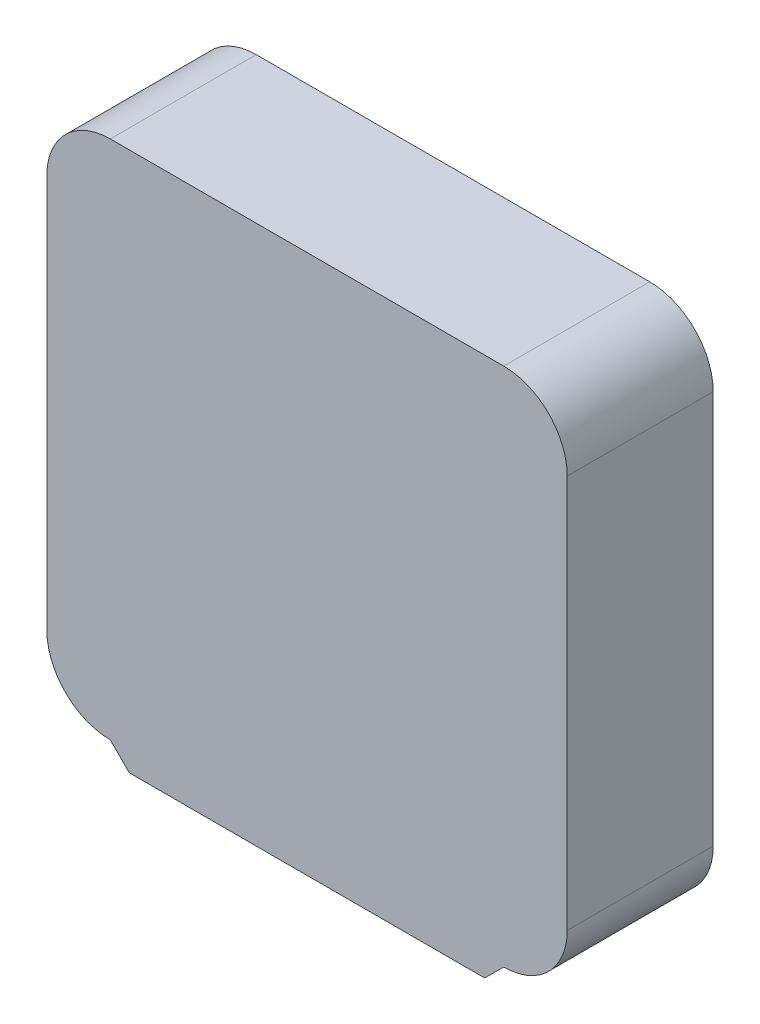
ISO-10303-21;
HEADER;
FILE_DESCRIPTION(('STEP AP214'),'2;1');
FILE_NAME('part.step','',(''),(''),'','','');
FILE_SCHEMA(('AUTOMOTIVE_DESIGN { 1 0 10303 214 1 1 1 1 }'));
ENDSEC;
DATA;
#1=APPLICATION_CONTEXT('core data for automotive mechanical design processes');
#2=APPLICATION_PROTOCOL_DEFINITION('international standard','automotive_design',2000,#1);
#3=PRODUCT_CONTEXT('',#1,'mechanical');
#4=PRODUCT('Part','Part','',(#3));
#5=PRODUCT_RELATED_PRODUCT_CATEGORY('part','',(#4));
#6=PRODUCT_DEFINITION_FORMATION('','',#4);
#7=PRODUCT_DEFINITION_CONTEXT('part definition',#1,'design');
#8=PRODUCT_DEFINITION('design','',#6,#7);
#9=PRODUCT_DEFINITION_SHAPE('','',#8);
#10=(LENGTH_UNIT() NAMED_UNIT(*) SI_UNIT(.MILLI.,.METRE.));
#11=(NAMED_UNIT(*) PLANE_ANGLE_UNIT() SI_UNIT($,.RADIAN.));
#12=(NAMED_UNIT(*) SI_UNIT($,.STERADIAN.) SOLID_ANGLE_UNIT());
#13=UNCERTAINTY_MEASURE_WITH_UNIT(LENGTH_MEASURE(1.E-05),#10,'distance_accuracy_value','');
#14=(GEOMETRIC_REPRESENTATION_CONTEXT(3) GLOBAL_UNCERTAINTY_ASSIGNED_CONTEXT((#13)) GLOBAL_UNIT_ASSIGNED_CONTEXT((#10,
#11,#12)) REPRESENTATION_CONTEXT('',''));
#15=CARTESIAN_POINT('',(0.,0.,0.));
#16=DIRECTION('',(0.,0.,1.));
#17=DIRECTION('',(1.,0.,0.));
#18=AXIS2_PLACEMENT_3D('',#15,#16,#17);
#19=CARTESIAN_POINT('',(3.80106510846566,0.848498758526367,0.));
#20=DIRECTION('',(0.,0.,1.));
#21=DIRECTION('',(1.,0.,0.));
#22=AXIS2_PLACEMENT_3D('',#19,#20,#21);
#23=PLANE('',#22);
#24=DIRECTION('',(-1.,0.,0.));
#25=VECTOR('',#24,1.);
#26=CARTESIAN_POINT('',(3.80106510846566,-21.1515012414736,0.));
#27=LINE('',#26,#25);
#28=CARTESIAN_POINT('',(17.8010651084656,-21.1515012414736,0.));
#29=VERTEX_POINT('',#28);
#30=CARTESIAN_POINT('',(-10.1989348915343,-21.1515012414736,0.));
#31=VERTEX_POINT('',#30);
#32=EDGE_CURVE('E176',#29,#31,#27,.T.);
#33=ORIENTED_EDGE('',*,*,#32,.T.);
#34=DIRECTION('',(0.707106781186547,-0.707106781186548,0.));
#35=VECTOR('',#34,1.);
#36=CARTESIAN_POINT('',(-10.9489348915343,-20.4015012414737,0.));
#37=LINE('',#36,#35);
#38=CARTESIAN_POINT('',(-11.6989348915343,-19.6515012414737,0.));
#39=VERTEX_POINT('',#38);
#40=EDGE_CURVE('E185',#39,#31,#37,.T.);
#41=ORIENTED_EDGE('',*,*,#40,.F.);
#42=CARTESIAN_POINT('',(-11.6989348915343,-14.6515012414736,0.));
#43=DIRECTION('',(0.,0.,1.));
#44=DIRECTION('',(1.,0.,0.));
#45=AXIS2_PLACEMENT_3D('',#42,#43,#44);
#46=CIRCLE('',#45,5.);
#47=CARTESIAN_POINT('',(-16.6989348915343,-14.6515012414736,0.));
#48=VERTEX_POINT('',#47);
#49=EDGE_CURVE('E164',#48,#39,#46,.T.);
#50=ORIENTED_EDGE('',*,*,#49,.F.);
#51=DIRECTION('',(0.,-1.,0.));
#52=VECTOR('',#51,1.);
#53=CARTESIAN_POINT('',(-16.6989348915343,-19.6515012414737,0.));
#54=LINE('',#53,#52);
#55=CARTESIAN_POINT('',(-16.6989348915343,16.3484987585264,0.));
#56=VERTEX_POINT('',#55);
#57=EDGE_CURVE('E194',#56,#48,#54,.T.);
#58=ORIENTED_EDGE('',*,*,#57,.F.);
#59=CARTESIAN_POINT('',(-11.6989348915343,16.3484987585264,0.));
#60=DIRECTION('',(0.,0.,1.));
#61=DIRECTION('',(1.,0.,0.));
#62=AXIS2_PLACEMENT_3D('',#59,#60,#61);
#63=CIRCLE('',#62,5.);
#64=CARTESIAN_POINT('',(-11.6989348915343,21.3484987585264,0.));
#65=VERTEX_POINT('',#64);
#66=EDGE_CURVE('E136',#65,#56,#63,.T.);
#67=ORIENTED_EDGE('',*,*,#66,.F.);
#68=DIRECTION('',(-1.,0.,0.));
#69=VECTOR('',#68,1.);
#70=CARTESIAN_POINT('',(-16.6989348915343,21.3484987585264,0.));
#71=LINE('',#70,#69);
#72=CARTESIAN_POINT('',(19.3010651084657,21.3484987585264,0.));
#73=VERTEX_POINT('',#72);
#74=EDGE_CURVE('E131',#73,#65,#71,.T.);
#75=ORIENTED_EDGE('',*,*,#74,.F.);
#76=CARTESIAN_POINT('',(19.3010651084657,16.3484987585264,0.));
#77=DIRECTION('',(0.,0.,1.));
#78=DIRECTION('',(1.,0.,0.));
#79=AXIS2_PLACEMENT_3D('',#76,#77,#78);
#80=CIRCLE('',#79,5.);
#81=CARTESIAN_POINT('',(24.3010651084657,16.3484987585264,0.));
#82=VERTEX_POINT('',#81);
#83=EDGE_CURVE('E203',#82,#73,#80,.T.);
#84=ORIENTED_EDGE('',*,*,#83,.F.);
#85=DIRECTION('',(0.,1.,0.));
#86=VECTOR('',#85,1.);
#87=CARTESIAN_POINT('',(24.3010651084657,21.3484987585264,0.));
#88=LINE('',#87,#86);
#89=CARTESIAN_POINT('',(24.3010651084657,-14.6515012414736,0.));
#90=VERTEX_POINT('',#89);
#91=EDGE_CURVE('E212',#90,#82,#88,.T.);
#92=ORIENTED_EDGE('',*,*,#91,.F.);
#93=CARTESIAN_POINT('',(19.3010651084657,-14.6515012414736,0.));
#94=DIRECTION('',(0.,0.,1.));
#95=DIRECTION('',(1.,0.,0.));
#96=AXIS2_PLACEMENT_3D('',#93,#94,#95);
#97=CIRCLE('',#96,5.);
#98=CARTESIAN_POINT('',(19.3010651084657,-19.6515012414737,0.));
#99=VERTEX_POINT('',#98);
#100=EDGE_CURVE('E48',#99,#90,#97,.T.);
#101=ORIENTED_EDGE('',*,*,#100,.F.);
#102=DIRECTION('',(0.707106781186546,0.707106781186549,0.));
#103=VECTOR('',#102,1.);
#104=CARTESIAN_POINT('',(18.5510651084656,-20.4015012414737,0.));
#105=LINE('',#104,#103);
#106=EDGE_CURVE('E11',#29,#99,#105,.T.);
#107=ORIENTED_EDGE('',*,*,#106,.F.);
#108=EDGE_LOOP('',(#33,#41,#50,#58,#67,#75,#84,#92,#101,#107));
#109=FACE_BOUND('',#108,.T.);
#110=ADVANCED_FACE('F18',(#109),#23,.F.);
#111=CARTESIAN_POINT('',(18.5510651084656,-20.4015012414737,8.625));
#112=DIRECTION('',(0.707106781186549,-0.707106781186546,0.));
#113=DIRECTION('',(0.,0.,-1.));
#114=AXIS2_PLACEMENT_3D('',#111,#112,#113);
#115=PLANE('',#114);
#116=DIRECTION('',(0.707106781186548,0.707106781186548,0.));
#117=VECTOR('',#116,1.);
#118=CARTESIAN_POINT('',(17.8010651084656,-21.1515012414736,11.5));
#119=LINE('',#118,#117);
#120=CARTESIAN_POINT('',(17.8010651084656,-21.1515012414736,11.5));
#121=VERTEX_POINT('',#120);
#122=CARTESIAN_POINT('',(19.3010651084657,-19.6515012414737,11.5));
#123=VERTEX_POINT('',#122);
#124=EDGE_CURVE('E675',#121,#123,#119,.T.);
#125=ORIENTED_EDGE('',*,*,#124,.F.);
#126=DIRECTION('',(0.,0.,-1.));
#127=VECTOR('',#126,1.);
#128=CARTESIAN_POINT('',(17.8010651084656,-21.1515012414736,5.75));
#129=LINE('',#128,#127);
#130=EDGE_CURVE('E180',#121,#29,#129,.T.);
#131=ORIENTED_EDGE('',*,*,#130,.T.);
#132=ORIENTED_EDGE('',*,*,#106,.T.);
#133=DIRECTION('',(0.,0.,-1.));
#134=VECTOR('',#133,1.);
#135=CARTESIAN_POINT('',(19.3010651084657,-19.6515012414737,0.));
#136=LINE('',#135,#134);
#137=EDGE_CURVE('E27',#123,#99,#136,.T.);
#138=ORIENTED_EDGE('',*,*,#137,.F.);
#139=EDGE_LOOP('',(#125,#131,#132,#138));
#140=FACE_BOUND('',#139,.T.);
#141=ADVANCED_FACE('F20',(#140),#115,.T.);
#142=CARTESIAN_POINT('',(19.3010651084657,-14.6515012414736,0.));
#143=DIRECTION('',(0.,0.,1.));
#144=DIRECTION('',(1.,0.,0.));
#145=AXIS2_PLACEMENT_3D('',#142,#143,#144);
#146=CYLINDRICAL_SURFACE('',#145,5.);
#147=ORIENTED_EDGE('',*,*,#100,.T.);
#148=DIRECTION('',(0.,0.,-1.));
#149=VECTOR('',#148,1.);
#150=CARTESIAN_POINT('',(24.3010651084657,-14.6515012414736,0.));
#151=LINE('',#150,#149);
#152=CARTESIAN_POINT('',(24.3010651084657,-14.6515012414736,11.5));
#153=VERTEX_POINT('',#152);
#154=EDGE_CURVE('E208',#153,#90,#151,.T.);
#155=ORIENTED_EDGE('',*,*,#154,.F.);
#156=CARTESIAN_POINT('',(19.3010651084657,-14.6515012414736,11.5));
#157=DIRECTION('',(0.,0.,1.));
#158=DIRECTION('',(1.,0.,0.));
#159=AXIS2_PLACEMENT_3D('',#156,#157,#158);
#160=CIRCLE('',#159,5.);
#161=EDGE_CURVE('E681',#123,#153,#160,.T.);
#162=ORIENTED_EDGE('',*,*,#161,.F.);
#163=ORIENTED_EDGE('',*,*,#137,.T.);
#164=EDGE_LOOP('',(#147,#155,#162,#163));
#165=FACE_BOUND('',#164,.T.);
#166=ADVANCED_FACE('F451',(#165),#146,.T.);
#167=CARTESIAN_POINT('',(24.3010651084657,21.3484987585264,0.));
#168=DIRECTION('',(1.,0.,0.));
#169=DIRECTION('',(0.,1.,0.));
#170=AXIS2_PLACEMENT_3D('',#167,#168,#169);
#171=PLANE('',#170);
#172=DIRECTION('',(0.,0.,-1.));
#173=VECTOR('',#172,1.);
#174=CARTESIAN_POINT('',(24.3010651084657,16.3484987585264,0.));
#175=LINE('',#174,#173);
#176=CARTESIAN_POINT('',(24.3010651084657,16.3484987585264,11.5));
#177=VERTEX_POINT('',#176);
#178=EDGE_CURVE('E204',#177,#82,#175,.T.);
#179=ORIENTED_EDGE('',*,*,#178,.F.);
#180=DIRECTION('',(0.,1.,0.));
#181=VECTOR('',#180,1.);
#182=CARTESIAN_POINT('',(24.3010651084657,0.848498758526368,11.5));
#183=LINE('',#182,#181);
#184=EDGE_CURVE('E160',#153,#177,#183,.T.);
#185=ORIENTED_EDGE('',*,*,#184,.F.);
#186=ORIENTED_EDGE('',*,*,#154,.T.);
#187=ORIENTED_EDGE('',*,*,#91,.T.);
#188=EDGE_LOOP('',(#179,#185,#186,#187));
#189=FACE_BOUND('',#188,.T.);
#190=ADVANCED_FACE('F408',(#189),#171,.T.);
#191=CARTESIAN_POINT('',(19.3010651084657,16.3484987585264,0.));
#192=DIRECTION('',(0.,0.,1.));
#193=DIRECTION('',(1.,0.,0.));
#194=AXIS2_PLACEMENT_3D('',#191,#192,#193);
#195=CYLINDRICAL_SURFACE('',#194,5.);
#196=ORIENTED_EDGE('',*,*,#83,.T.);
#197=DIRECTION('',(0.,0.,-1.));
#198=VECTOR('',#197,1.);
#199=CARTESIAN_POINT('',(19.3010651084657,21.3484987585264,0.));
#200=LINE('',#199,#198);
#201=CARTESIAN_POINT('',(19.3010651084657,21.3484987585264,11.5));
#202=VERTEX_POINT('',#201);
#203=EDGE_CURVE('E135',#202,#73,#200,.T.);
#204=ORIENTED_EDGE('',*,*,#203,.F.);
#205=CARTESIAN_POINT('',(19.3010651084657,16.3484987585264,11.5));
#206=DIRECTION('',(0.,0.,1.));
#207=DIRECTION('',(1.,0.,0.));
#208=AXIS2_PLACEMENT_3D('',#205,#206,#207);
#209=CIRCLE('',#208,5.);
#210=EDGE_CURVE('E153',#177,#202,#209,.T.);
#211=ORIENTED_EDGE('',*,*,#210,.F.);
#212=ORIENTED_EDGE('',*,*,#178,.T.);
#213=EDGE_LOOP('',(#196,#204,#211,#212));
#214=FACE_BOUND('',#213,.T.);
#215=ADVANCED_FACE('F404',(#214),#195,.T.);
#216=CARTESIAN_POINT('',(-16.6989348915343,21.3484987585264,0.));
#217=DIRECTION('',(0.,1.,0.));
#218=DIRECTION('',(1.,0.,0.));
#219=AXIS2_PLACEMENT_3D('',#216,#217,#218);
#220=PLANE('',#219);
#221=DIRECTION('',(0.,0.,-1.));
#222=VECTOR('',#221,1.);
#223=CARTESIAN_POINT('',(-11.6989348915343,21.3484987585264,0.));
#224=LINE('',#223,#222);
#225=CARTESIAN_POINT('',(-11.6989348915343,21.3484987585264,11.5));
#226=VERTEX_POINT('',#225);
#227=EDGE_CURVE('E123',#226,#65,#224,.T.);
#228=ORIENTED_EDGE('',*,*,#227,.F.);
#229=DIRECTION('',(-1.,0.,0.));
#230=VECTOR('',#229,1.);
#231=CARTESIAN_POINT('',(3.80106510846566,21.3484987585264,11.5));
#232=LINE('',#231,#230);
#233=EDGE_CURVE('E128',#202,#226,#232,.T.);
#234=ORIENTED_EDGE('',*,*,#233,.F.);
#235=ORIENTED_EDGE('',*,*,#203,.T.);
#236=ORIENTED_EDGE('',*,*,#74,.T.);
#237=EDGE_LOOP('',(#228,#234,#235,#236));
#238=FACE_BOUND('',#237,.T.);
#239=ADVANCED_FACE('F125',(#238),#220,.T.);
#240=CARTESIAN_POINT('',(-11.6989348915343,16.3484987585264,0.));
#241=DIRECTION('',(0.,0.,1.));
#242=DIRECTION('',(1.,0.,0.));
#243=AXIS2_PLACEMENT_3D('',#240,#241,#242);
#244=CYLINDRICAL_SURFACE('',#243,5.);
#245=ORIENTED_EDGE('',*,*,#66,.T.);
#246=DIRECTION('',(0.,0.,-1.));
#247=VECTOR('',#246,1.);
#248=CARTESIAN_POINT('',(-16.6989348915343,16.3484987585264,0.));
#249=LINE('',#248,#247);
#250=CARTESIAN_POINT('',(-16.6989348915343,16.3484987585264,11.5));
#251=VERTEX_POINT('',#250);
#252=EDGE_CURVE('E142',#251,#56,#249,.T.);
#253=ORIENTED_EDGE('',*,*,#252,.F.);
#254=CARTESIAN_POINT('',(-11.6989348915343,16.3484987585264,11.5));
#255=DIRECTION('',(0.,0.,1.));
#256=DIRECTION('',(1.,0.,0.));
#257=AXIS2_PLACEMENT_3D('',#254,#255,#256);
#258=CIRCLE('',#257,5.);
#259=EDGE_CURVE('E139',#226,#251,#258,.T.);
#260=ORIENTED_EDGE('',*,*,#259,.F.);
#261=ORIENTED_EDGE('',*,*,#227,.T.);
#262=EDGE_LOOP('',(#245,#253,#260,#261));
#263=FACE_BOUND('',#262,.T.);
#264=ADVANCED_FACE('F140',(#263),#244,.T.);
#265=CARTESIAN_POINT('',(-16.6989348915343,-19.6515012414737,0.));
#266=DIRECTION('',(-1.,0.,0.));
#267=DIRECTION('',(0.,0.,1.));
#268=AXIS2_PLACEMENT_3D('',#265,#266,#267);
#269=PLANE('',#268);
#270=ORIENTED_EDGE('',*,*,#252,.T.);
#271=ORIENTED_EDGE('',*,*,#57,.T.);
#272=DIRECTION('',(0.,0.,-1.));
#273=VECTOR('',#272,1.);
#274=CARTESIAN_POINT('',(-16.6989348915343,-14.6515012414736,0.));
#275=LINE('',#274,#273);
#276=CARTESIAN_POINT('',(-16.6989348915343,-14.6515012414736,11.5));
#277=VERTEX_POINT('',#276);
#278=EDGE_CURVE('E166',#277,#48,#275,.T.);
#279=ORIENTED_EDGE('',*,*,#278,.F.);
#280=DIRECTION('',(0.,-1.,0.));
#281=VECTOR('',#280,1.);
#282=CARTESIAN_POINT('',(-16.6989348915343,0.848498758526368,11.5));
#283=LINE('',#282,#281);
#284=EDGE_CURVE('E147',#251,#277,#283,.T.);
#285=ORIENTED_EDGE('',*,*,#284,.F.);
#286=EDGE_LOOP('',(#270,#271,#279,#285));
#287=FACE_BOUND('',#286,.T.);
#288=ADVANCED_FACE('F380',(#287),#269,.T.);
#289=CARTESIAN_POINT('',(-11.6989348915343,-14.6515012414736,0.));
#290=DIRECTION('',(0.,0.,1.));
#291=DIRECTION('',(1.,0.,0.));
#292=AXIS2_PLACEMENT_3D('',#289,#290,#291);
#293=CYLINDRICAL_SURFACE('',#292,5.);
#294=ORIENTED_EDGE('',*,*,#49,.T.);
#295=DIRECTION('',(0.,0.,-1.));
#296=VECTOR('',#295,1.);
#297=CARTESIAN_POINT('',(-11.6989348915343,-19.6515012414737,2.875));
#298=LINE('',#297,#296);
#299=CARTESIAN_POINT('',(-11.6989348915343,-19.6515012414737,11.5));
#300=VERTEX_POINT('',#299);
#301=EDGE_CURVE('E167',#300,#39,#298,.T.);
#302=ORIENTED_EDGE('',*,*,#301,.F.);
#303=CARTESIAN_POINT('',(-11.6989348915343,-14.6515012414736,11.5));
#304=DIRECTION('',(0.,0.,1.));
#305=DIRECTION('',(1.,0.,0.));
#306=AXIS2_PLACEMENT_3D('',#303,#304,#305);
#307=CIRCLE('',#306,5.);
#308=EDGE_CURVE('E171',#277,#300,#307,.T.);
#309=ORIENTED_EDGE('',*,*,#308,.F.);
#310=ORIENTED_EDGE('',*,*,#278,.T.);
#311=EDGE_LOOP('',(#294,#302,#309,#310));
#312=FACE_BOUND('',#311,.T.);
#313=ADVANCED_FACE('F384',(#312),#293,.T.);
#314=CARTESIAN_POINT('',(-10.9489348915343,-20.4015012414737,2.875));
#315=DIRECTION('',(-0.707106781186548,-0.707106781186547,0.));
#316=DIRECTION('',(-0.707106781186547,0.707106781186548,0.));
#317=AXIS2_PLACEMENT_3D('',#314,#315,#316);
#318=PLANE('',#317);
#319=ORIENTED_EDGE('',*,*,#40,.T.);
#320=DIRECTION('',(0.,0.,1.));
#321=VECTOR('',#320,1.);
#322=CARTESIAN_POINT('',(-10.1989348915343,-21.1515012414736,5.75));
#323=LINE('',#322,#321);
#324=CARTESIAN_POINT('',(-10.1989348915343,-21.1515012414736,11.5));
#325=VERTEX_POINT('',#324);
#326=EDGE_CURVE('E175',#31,#325,#323,.T.);
#327=ORIENTED_EDGE('',*,*,#326,.T.);
#328=DIRECTION('',(0.707106781186549,-0.707106781186546,0.));
#329=VECTOR('',#328,1.);
#330=CARTESIAN_POINT('',(-11.6989348915343,-19.6515012414737,11.5));
#331=LINE('',#330,#329);
#332=EDGE_CURVE('E686',#300,#325,#331,.T.);
#333=ORIENTED_EDGE('',*,*,#332,.F.);
#334=ORIENTED_EDGE('',*,*,#301,.T.);
#335=EDGE_LOOP('',(#319,#327,#333,#334));
#336=FACE_BOUND('',#335,.T.);
#337=ADVANCED_FACE('F371',(#336),#318,.T.);
#338=CARTESIAN_POINT('',(3.80106510846566,-21.1515012414736,5.75));
#339=DIRECTION('',(0.,1.,0.));
#340=DIRECTION('',(1.,0.,0.));
#341=AXIS2_PLACEMENT_3D('',#338,#339,#340);
#342=PLANE('',#341);
#343=DIRECTION('',(1.,0.,0.));
#344=VECTOR('',#343,1.);
#345=CARTESIAN_POINT('',(3.80106510846566,-21.1515012414736,11.5));
#346=LINE('',#345,#344);
#347=EDGE_CURVE('E682',#325,#121,#346,.T.);
#348=ORIENTED_EDGE('',*,*,#347,.F.);
#349=ORIENTED_EDGE('',*,*,#326,.F.);
#350=ORIENTED_EDGE('',*,*,#32,.F.);
#351=ORIENTED_EDGE('',*,*,#130,.F.);
#352=EDGE_LOOP('',(#348,#349,#350,#351));
#353=FACE_BOUND('',#352,.T.);
#354=ADVANCED_FACE('F348',(#353),#342,.F.);
#355=CARTESIAN_POINT('',(3.80106510846566,0.848498758526368,11.5));
#356=DIRECTION('',(0.,0.,1.));
#357=DIRECTION('',(1.,0.,0.));
#358=AXIS2_PLACEMENT_3D('',#355,#356,#357);
#359=PLANE('',#358);
#360=ORIENTED_EDGE('',*,*,#332,.T.);
#361=ORIENTED_EDGE('',*,*,#347,.T.);
#362=ORIENTED_EDGE('',*,*,#124,.T.);
#363=ORIENTED_EDGE('',*,*,#161,.T.);
#364=ORIENTED_EDGE('',*,*,#184,.T.);
#365=ORIENTED_EDGE('',*,*,#210,.T.);
#366=ORIENTED_EDGE('',*,*,#233,.T.);
#367=ORIENTED_EDGE('',*,*,#259,.T.);
#368=ORIENTED_EDGE('',*,*,#284,.T.);
#369=ORIENTED_EDGE('',*,*,#308,.T.);
#370=EDGE_LOOP('',(#360,#361,#362,#363,#364,#365,#366,#367,#368,#369));
#371=FACE_BOUND('',#370,.T.);
#372=ADVANCED_FACE('F150',(#371),#359,.T.);
#373=CLOSED_SHELL('',(#110,#141,#166,#190,#215,#239,#264,#288,#313,#337,#354,#372));
#374=MANIFOLD_SOLID_BREP('B1',#373);
#375=ADVANCED_BREP_SHAPE_REPRESENTATION('',(#18,#374),#14);
#376=SHAPE_DEFINITION_REPRESENTATION(#9,#375);
ENDSEC;
END-ISO-10303-21;
